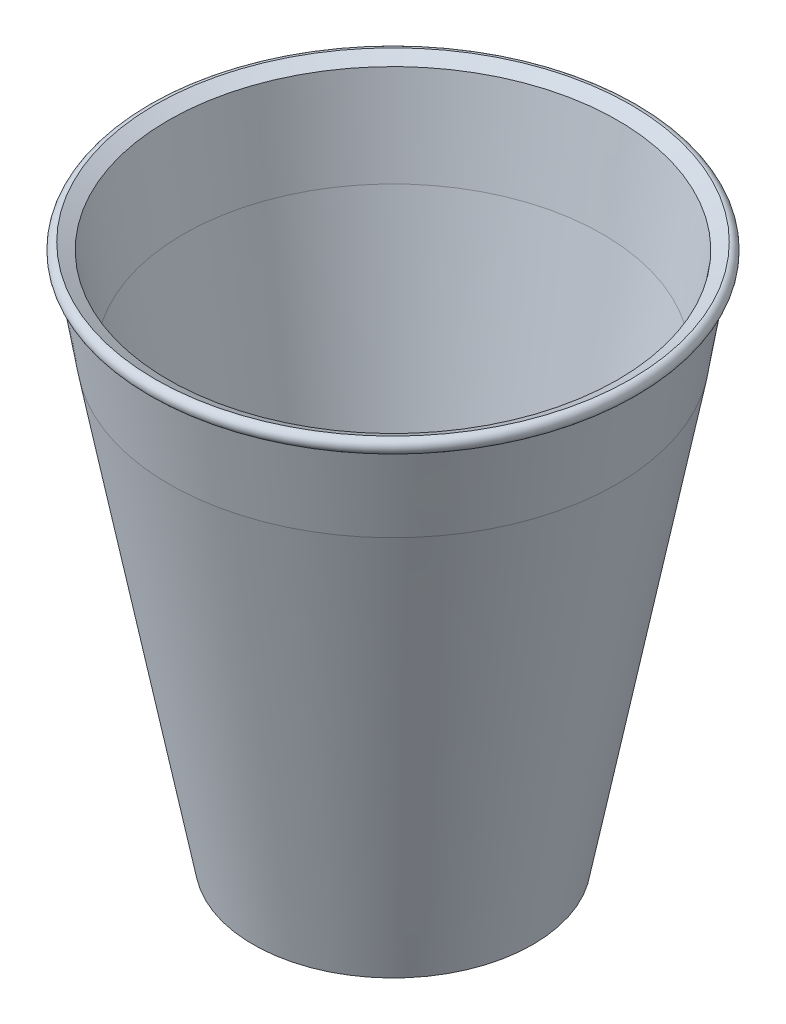
ISO-10303-21;
HEADER;
FILE_DESCRIPTION(('STEP AP214'),'2;1');
FILE_NAME('part.step','',(''),(''),'','','');
FILE_SCHEMA(('AUTOMOTIVE_DESIGN { 1 0 10303 214 1 1 1 1 }'));
ENDSEC;
DATA;
#1=APPLICATION_CONTEXT('core data for automotive mechanical design processes');
#2=APPLICATION_PROTOCOL_DEFINITION('international standard','automotive_design',2000,#1);
#3=PRODUCT_CONTEXT('',#1,'mechanical');
#4=PRODUCT('Part','Part','',(#3));
#5=PRODUCT_RELATED_PRODUCT_CATEGORY('part','',(#4));
#6=PRODUCT_DEFINITION_FORMATION('','',#4);
#7=PRODUCT_DEFINITION_CONTEXT('part definition',#1,'design');
#8=PRODUCT_DEFINITION('design','',#6,#7);
#9=PRODUCT_DEFINITION_SHAPE('','',#8);
#10=(LENGTH_UNIT() NAMED_UNIT(*) SI_UNIT(.MILLI.,.METRE.));
#11=(NAMED_UNIT(*) PLANE_ANGLE_UNIT() SI_UNIT($,.RADIAN.));
#12=(NAMED_UNIT(*) SI_UNIT($,.STERADIAN.) SOLID_ANGLE_UNIT());
#13=UNCERTAINTY_MEASURE_WITH_UNIT(LENGTH_MEASURE(1.E-05),#10,'distance_accuracy_value','');
#14=(GEOMETRIC_REPRESENTATION_CONTEXT(3) GLOBAL_UNCERTAINTY_ASSIGNED_CONTEXT((#13)) GLOBAL_UNIT_ASSIGNED_CONTEXT((#10,
#11,#12)) REPRESENTATION_CONTEXT('',''));
#15=CARTESIAN_POINT('',(0.,0.,0.));
#16=DIRECTION('',(0.,0.,1.));
#17=DIRECTION('',(1.,0.,0.));
#18=AXIS2_PLACEMENT_3D('',#15,#16,#17);
#19=CARTESIAN_POINT('',(-12.6,-75.5,0.));
#20=DIRECTION('',(0.,-1.,0.));
#21=DIRECTION('',(1.,0.,0.));
#22=AXIS2_PLACEMENT_3D('',#19,#20,#21);
#23=PLANE('',#22);
#24=CARTESIAN_POINT('',(0.,-75.5,0.));
#25=DIRECTION('',(0.,1.,0.));
#26=DIRECTION('',(-1.,0.,0.));
#27=AXIS2_PLACEMENT_3D('',#24,#25,#26);
#28=CIRCLE('',#27,12.6);
#29=CARTESIAN_POINT('',(-12.6,-75.5,0.));
#30=VERTEX_POINT('',#29);
#31=EDGE_CURVE('E11',#30,#30,#28,.T.);
#32=ORIENTED_EDGE('',*,*,#31,.F.);
#33=EDGE_LOOP('',(#32));
#34=FACE_BOUND('',#33,.T.);
#35=ADVANCED_FACE('F37',(#34),#23,.T.);
#36=CARTESIAN_POINT('',(0.,0.,0.));
#37=DIRECTION('',(0.,1.,0.));
#38=DIRECTION('',(-1.,0.,0.));
#39=AXIS2_PLACEMENT_3D('',#36,#37,#38);
#40=CYLINDRICAL_SURFACE('',#39,12.6);
#41=DIRECTION('',(0.,-1.,0.));
#42=VECTOR('',#41,1.);
#43=CARTESIAN_POINT('',(12.5975195971271,-76.5,-0.249999999999868));
#44=LINE('',#43,#42);
#45=CARTESIAN_POINT('',(12.5975195971271,-76.5,-0.249999999999868));
#46=VERTEX_POINT('',#45);
#47=CARTESIAN_POINT('',(12.5975195971271,-77.,-0.249999999999867));
#48=VERTEX_POINT('',#47);
#49=EDGE_CURVE('E675',#46,#48,#44,.T.);
#50=ORIENTED_EDGE('',*,*,#49,.F.);
#51=CARTESIAN_POINT('',(0.,-76.5,0.));
#52=DIRECTION('',(0.,-1.,0.));
#53=DIRECTION('',(0.,0.,-1.));
#54=AXIS2_PLACEMENT_3D('',#51,#52,#53);
#55=CIRCLE('',#54,12.6);
#56=CARTESIAN_POINT('',(12.5975195971271,-76.5,0.250000000000132));
#57=VERTEX_POINT('',#56);
#58=EDGE_CURVE('E658',#46,#57,#55,.T.);
#59=ORIENTED_EDGE('',*,*,#58,.T.);
#60=DIRECTION('',(0.,-1.,0.));
#61=VECTOR('',#60,1.);
#62=CARTESIAN_POINT('',(12.5975195971271,-76.5,0.250000000000132));
#63=LINE('',#62,#61);
#64=CARTESIAN_POINT('',(12.5975195971271,-77.,0.250000000000132));
#65=VERTEX_POINT('',#64);
#66=EDGE_CURVE('E657',#57,#65,#63,.T.);
#67=ORIENTED_EDGE('',*,*,#66,.T.);
#68=CARTESIAN_POINT('',(0.,-77.,0.));
#69=DIRECTION('',(0.,1.,0.));
#70=DIRECTION('',(-1.,0.,0.));
#71=AXIS2_PLACEMENT_3D('',#68,#69,#70);
#72=CIRCLE('',#71,12.6);
#73=CARTESIAN_POINT('',(0.250000000000009,-77.,12.597519597127));
#74=VERTEX_POINT('',#73);
#75=EDGE_CURVE('E45',#74,#65,#72,.T.);
#76=ORIENTED_EDGE('',*,*,#75,.F.);
#77=DIRECTION('',(0.,-1.,0.));
#78=VECTOR('',#77,1.);
#79=CARTESIAN_POINT('',(0.250000000000009,-76.5,12.597519597127));
#80=LINE('',#79,#78);
#81=CARTESIAN_POINT('',(0.250000000000009,-76.5,12.597519597127));
#82=VERTEX_POINT('',#81);
#83=EDGE_CURVE('E255',#82,#74,#80,.T.);
#84=ORIENTED_EDGE('',*,*,#83,.F.);
#85=CARTESIAN_POINT('',(0.,-76.5,0.));
#86=DIRECTION('',(0.,-1.,0.));
#87=DIRECTION('',(1.,0.,0.));
#88=AXIS2_PLACEMENT_3D('',#85,#86,#87);
#89=CIRCLE('',#88,12.6);
#90=CARTESIAN_POINT('',(-0.249999999999991,-76.5,12.597519597127));
#91=VERTEX_POINT('',#90);
#92=EDGE_CURVE('E52',#82,#91,#89,.T.);
#93=ORIENTED_EDGE('',*,*,#92,.T.);
#94=DIRECTION('',(0.,-1.,0.));
#95=VECTOR('',#94,1.);
#96=CARTESIAN_POINT('',(-0.249999999999991,-76.5,12.597519597127));
#97=LINE('',#96,#95);
#98=CARTESIAN_POINT('',(-0.249999999999991,-77.,12.597519597127));
#99=VERTEX_POINT('',#98);
#100=EDGE_CURVE('E186',#91,#99,#97,.T.);
#101=ORIENTED_EDGE('',*,*,#100,.T.);
#102=CARTESIAN_POINT('',(-12.597519597127,-77.,0.249999999999955));
#103=VERTEX_POINT('',#102);
#104=EDGE_CURVE('E164',#103,#99,#72,.T.);
#105=ORIENTED_EDGE('',*,*,#104,.F.);
#106=DIRECTION('',(0.,-1.,0.));
#107=VECTOR('',#106,1.);
#108=CARTESIAN_POINT('',(-12.597519597127,-76.5,0.249999999999956));
#109=LINE('',#108,#107);
#110=CARTESIAN_POINT('',(-12.597519597127,-76.5,0.249999999999956));
#111=VERTEX_POINT('',#110);
#112=EDGE_CURVE('E173',#111,#103,#109,.T.);
#113=ORIENTED_EDGE('',*,*,#112,.F.);
#114=CARTESIAN_POINT('',(0.,-76.5,0.));
#115=DIRECTION('',(0.,-1.,0.));
#116=DIRECTION('',(0.,0.,1.));
#117=AXIS2_PLACEMENT_3D('',#114,#115,#116);
#118=CIRCLE('',#117,12.6);
#119=CARTESIAN_POINT('',(-12.597519597127,-76.5,-0.250000000000044));
#120=VERTEX_POINT('',#119);
#121=EDGE_CURVE('E221',#111,#120,#118,.T.);
#122=ORIENTED_EDGE('',*,*,#121,.T.);
#123=DIRECTION('',(0.,-1.,0.));
#124=VECTOR('',#123,1.);
#125=CARTESIAN_POINT('',(-12.597519597127,-76.5,-0.250000000000044));
#126=LINE('',#125,#124);
#127=CARTESIAN_POINT('',(-12.597519597127,-77.,-0.250000000000044));
#128=VERTEX_POINT('',#127);
#129=EDGE_CURVE('E230',#120,#128,#126,.T.);
#130=ORIENTED_EDGE('',*,*,#129,.T.);
#131=CARTESIAN_POINT('',(-0.24999999999999,-77.,-12.597519597127));
#132=VERTEX_POINT('',#131);
#133=EDGE_CURVE('E168',#132,#128,#72,.T.);
#134=ORIENTED_EDGE('',*,*,#133,.F.);
#135=DIRECTION('',(0.,-1.,0.));
#136=VECTOR('',#135,1.);
#137=CARTESIAN_POINT('',(-0.249999999999991,-76.5,-12.597519597127));
#138=LINE('',#137,#136);
#139=CARTESIAN_POINT('',(-0.249999999999991,-76.5,-12.597519597127));
#140=VERTEX_POINT('',#139);
#141=EDGE_CURVE('E224',#140,#132,#138,.T.);
#142=ORIENTED_EDGE('',*,*,#141,.F.);
#143=CARTESIAN_POINT('',(0.,-76.5,0.));
#144=DIRECTION('',(0.,-1.,0.));
#145=DIRECTION('',(-1.,0.,0.));
#146=AXIS2_PLACEMENT_3D('',#143,#144,#145);
#147=CIRCLE('',#146,12.6);
#148=CARTESIAN_POINT('',(0.250000000000009,-76.5,-12.597519597127));
#149=VERTEX_POINT('',#148);
#150=EDGE_CURVE('E205',#140,#149,#147,.T.);
#151=ORIENTED_EDGE('',*,*,#150,.T.);
#152=DIRECTION('',(0.,-1.,0.));
#153=VECTOR('',#152,1.);
#154=CARTESIAN_POINT('',(0.250000000000009,-76.5,-12.597519597127));
#155=LINE('',#154,#153);
#156=CARTESIAN_POINT('',(0.250000000000009,-77.,-12.597519597127));
#157=VERTEX_POINT('',#156);
#158=EDGE_CURVE('E203',#149,#157,#155,.T.);
#159=ORIENTED_EDGE('',*,*,#158,.T.);
#160=EDGE_CURVE('E188',#48,#157,#72,.T.);
#161=ORIENTED_EDGE('',*,*,#160,.F.);
#162=EDGE_LOOP('',(#50,#59,#67,#76,#84,#93,#101,#105,#113,#122,#130,#134,#142,#151,#159,#161));
#163=FACE_BOUND('',#162,.T.);
#164=ORIENTED_EDGE('',*,*,#31,.T.);
#165=EDGE_LOOP('',(#164));
#166=FACE_BOUND('',#165,.T.);
#167=ADVANCED_FACE('F184',(#163,#166),#40,.F.);
#168=CARTESIAN_POINT('',(-20.,-77.,0.));
#169=DIRECTION('',(0.,-1.,0.));
#170=DIRECTION('',(1.,0.,0.));
#171=AXIS2_PLACEMENT_3D('',#168,#169,#170);
#172=PLANE('',#171);
#173=DIRECTION('',(0.,0.,-1.));
#174=VECTOR('',#173,1.);
#175=CARTESIAN_POINT('',(-12.597519597127,-77.,0.249999999999955));
#176=LINE('',#175,#174);
#177=EDGE_CURVE('E148',#103,#128,#176,.T.);
#178=ORIENTED_EDGE('',*,*,#177,.F.);
#179=ORIENTED_EDGE('',*,*,#104,.T.);
#180=DIRECTION('',(-1.,0.,0.));
#181=VECTOR('',#180,1.);
#182=CARTESIAN_POINT('',(0.250000000000009,-77.,12.597519597127));
#183=LINE('',#182,#181);
#184=EDGE_CURVE('E240',#74,#99,#183,.T.);
#185=ORIENTED_EDGE('',*,*,#184,.F.);
#186=ORIENTED_EDGE('',*,*,#75,.T.);
#187=DIRECTION('',(0.,0.,1.));
#188=VECTOR('',#187,1.);
#189=CARTESIAN_POINT('',(12.5975195971271,-77.,-0.249999999999867));
#190=LINE('',#189,#188);
#191=EDGE_CURVE('E200',#48,#65,#190,.T.);
#192=ORIENTED_EDGE('',*,*,#191,.F.);
#193=ORIENTED_EDGE('',*,*,#160,.T.);
#194=DIRECTION('',(1.,0.,0.));
#195=VECTOR('',#194,1.);
#196=CARTESIAN_POINT('',(-0.24999999999999,-77.,-12.597519597127));
#197=LINE('',#196,#195);
#198=EDGE_CURVE('E198',#132,#157,#197,.T.);
#199=ORIENTED_EDGE('',*,*,#198,.F.);
#200=ORIENTED_EDGE('',*,*,#133,.T.);
#201=EDGE_LOOP('',(#178,#179,#185,#186,#192,#193,#199,#200));
#202=FACE_BOUND('',#201,.T.);
#203=CARTESIAN_POINT('',(0.,-77.,0.));
#204=DIRECTION('',(0.,1.,0.));
#205=DIRECTION('',(-1.,0.,0.));
#206=AXIS2_PLACEMENT_3D('',#203,#204,#205);
#207=CIRCLE('',#206,20.);
#208=CARTESIAN_POINT('',(-20.,-77.,0.));
#209=VERTEX_POINT('',#208);
#210=EDGE_CURVE('E187',#209,#209,#207,.T.);
#211=ORIENTED_EDGE('',*,*,#210,.F.);
#212=EDGE_LOOP('',(#211));
#213=FACE_BOUND('',#212,.T.);
#214=ADVANCED_FACE('F160',(#202,#213),#172,.T.);
#215=CARTESIAN_POINT('',(0.,-14.,0.));
#216=DIRECTION('',(0.,1.,0.));
#217=DIRECTION('',(-1.,0.,0.));
#218=AXIS2_PLACEMENT_3D('',#215,#216,#217);
#219=CONICAL_SURFACE('',#218,32.,0.188221505304771);
#220=ORIENTED_EDGE('',*,*,#210,.T.);
#221=EDGE_LOOP('',(#220));
#222=FACE_BOUND('',#221,.T.);
#223=CARTESIAN_POINT('',(0.,-14.,0.));
#224=DIRECTION('',(0.,1.,0.));
#225=DIRECTION('',(-1.,0.,0.));
#226=AXIS2_PLACEMENT_3D('',#223,#224,#225);
#227=CIRCLE('',#226,32.);
#228=CARTESIAN_POINT('',(-32.,-14.,0.));
#229=VERTEX_POINT('',#228);
#230=EDGE_CURVE('E190',#229,#229,#227,.T.);
#231=ORIENTED_EDGE('',*,*,#230,.F.);
#232=EDGE_LOOP('',(#231));
#233=FACE_BOUND('',#232,.T.);
#234=ADVANCED_FACE('F286',(#222,#233),#219,.T.);
#235=CARTESIAN_POINT('',(0.,-2.,0.));
#236=DIRECTION('',(0.,1.,0.));
#237=DIRECTION('',(-1.,0.,0.));
#238=AXIS2_PLACEMENT_3D('',#235,#236,#237);
#239=CONICAL_SURFACE('',#238,34.,0.165148677414627);
#240=ORIENTED_EDGE('',*,*,#230,.T.);
#241=EDGE_LOOP('',(#240));
#242=FACE_BOUND('',#241,.T.);
#243=CARTESIAN_POINT('',(0.,-2.,0.));
#244=DIRECTION('',(0.,1.,0.));
#245=DIRECTION('',(-1.,0.,0.));
#246=AXIS2_PLACEMENT_3D('',#243,#244,#245);
#247=CIRCLE('',#246,34.);
#248=CARTESIAN_POINT('',(-34.,-2.,0.));
#249=VERTEX_POINT('',#248);
#250=EDGE_CURVE('E277',#249,#249,#247,.T.);
#251=ORIENTED_EDGE('',*,*,#250,.F.);
#252=EDGE_LOOP('',(#251));
#253=FACE_BOUND('',#252,.T.);
#254=ADVANCED_FACE('F283',(#242,#253),#239,.T.);
#255=CARTESIAN_POINT('',(0.,-0.999999999999996,0.));
#256=DIRECTION('',(0.,1.,0.));
#257=DIRECTION('',(-1.,0.,0.));
#258=AXIS2_PLACEMENT_3D('',#255,#256,#257);
#259=TOROIDAL_SURFACE('',#258,34.,1.);
#260=ORIENTED_EDGE('',*,*,#250,.T.);
#261=EDGE_LOOP('',(#260));
#262=FACE_BOUND('',#261,.T.);
#263=CARTESIAN_POINT('',(0.,0.,0.));
#264=DIRECTION('',(0.,1.,0.));
#265=DIRECTION('',(-1.,0.,0.));
#266=AXIS2_PLACEMENT_3D('',#263,#264,#265);
#267=CIRCLE('',#266,34.);
#268=CARTESIAN_POINT('',(-34.,0.,0.));
#269=VERTEX_POINT('',#268);
#270=EDGE_CURVE('E274',#269,#269,#267,.T.);
#271=ORIENTED_EDGE('',*,*,#270,.F.);
#272=EDGE_LOOP('',(#271));
#273=FACE_BOUND('',#272,.T.);
#274=ADVANCED_FACE('F294',(#262,#273),#259,.T.);
#275=CARTESIAN_POINT('',(0.,-0.999999999999995,0.));
#276=DIRECTION('',(0.,1.,0.));
#277=DIRECTION('',(-1.,0.,0.));
#278=AXIS2_PLACEMENT_3D('',#275,#276,#277);
#279=CONICAL_SURFACE('',#278,32.130708730816,1.07957178018462);
#280=ORIENTED_EDGE('',*,*,#270,.T.);
#281=EDGE_LOOP('',(#280));
#282=FACE_BOUND('',#281,.T.);
#283=CARTESIAN_POINT('',(0.,-0.999999999999995,0.));
#284=DIRECTION('',(0.,1.,0.));
#285=DIRECTION('',(-1.,0.,0.));
#286=AXIS2_PLACEMENT_3D('',#283,#284,#285);
#287=CIRCLE('',#286,32.130708730816);
#288=CARTESIAN_POINT('',(-32.130708730816,-0.999999999999999,0.));
#289=VERTEX_POINT('',#288);
#290=EDGE_CURVE('E271',#289,#289,#287,.T.);
#291=ORIENTED_EDGE('',*,*,#290,.F.);
#292=EDGE_LOOP('',(#291));
#293=FACE_BOUND('',#292,.T.);
#294=ADVANCED_FACE('F566',(#282,#293),#279,.F.);
#295=CARTESIAN_POINT('',(0.,-14.,0.));
#296=DIRECTION('',(0.,1.,0.));
#297=DIRECTION('',(-1.,0.,0.));
#298=AXIS2_PLACEMENT_3D('',#295,#296,#297);
#299=CONICAL_SURFACE('',#298,29.9640420641493,0.165148677414627);
#300=ORIENTED_EDGE('',*,*,#290,.T.);
#301=EDGE_LOOP('',(#300));
#302=FACE_BOUND('',#301,.T.);
#303=CARTESIAN_POINT('',(0.,-14.,0.));
#304=DIRECTION('',(0.,1.,0.));
#305=DIRECTION('',(-1.,0.,0.));
#306=AXIS2_PLACEMENT_3D('',#303,#304,#305);
#307=CIRCLE('',#306,29.9640420641493);
#308=CARTESIAN_POINT('',(-29.9640420641493,-14.,0.));
#309=VERTEX_POINT('',#308);
#310=EDGE_CURVE('E268',#309,#309,#307,.T.);
#311=ORIENTED_EDGE('',*,*,#310,.F.);
#312=EDGE_LOOP('',(#311));
#313=FACE_BOUND('',#312,.T.);
#314=ADVANCED_FACE('F556',(#302,#313),#299,.F.);
#315=CARTESIAN_POINT('',(0.,-74.,0.));
#316=DIRECTION('',(0.,1.,0.));
#317=DIRECTION('',(-1.,0.,0.));
#318=AXIS2_PLACEMENT_3D('',#315,#316,#317);
#319=CONICAL_SURFACE('',#318,18.5354706355779,0.188221505304771);
#320=ORIENTED_EDGE('',*,*,#310,.T.);
#321=EDGE_LOOP('',(#320));
#322=FACE_BOUND('',#321,.T.);
#323=CARTESIAN_POINT('',(0.,-74.,0.));
#324=DIRECTION('',(0.,1.,0.));
#325=DIRECTION('',(-1.,0.,0.));
#326=AXIS2_PLACEMENT_3D('',#323,#324,#325);
#327=CIRCLE('',#326,18.5354706355779);
#328=CARTESIAN_POINT('',(-18.5354706355779,-74.,0.));
#329=VERTEX_POINT('',#328);
#330=EDGE_CURVE('E258',#329,#329,#327,.T.);
#331=ORIENTED_EDGE('',*,*,#330,.F.);
#332=EDGE_LOOP('',(#331));
#333=FACE_BOUND('',#332,.T.);
#334=ADVANCED_FACE('F546',(#322,#333),#319,.F.);
#335=CARTESIAN_POINT('',(0.,-74.,0.));
#336=DIRECTION('',(0.,1.,0.));
#337=DIRECTION('',(-1.,0.,0.));
#338=AXIS2_PLACEMENT_3D('',#335,#336,#337);
#339=PLANE('',#338);
#340=ORIENTED_EDGE('',*,*,#330,.T.);
#341=EDGE_LOOP('',(#340));
#342=FACE_BOUND('',#341,.T.);
#343=ADVANCED_FACE('F535',(#342),#339,.T.);
#344=CARTESIAN_POINT('',(0.250000000000009,-76.5,12.597519597127));
#345=DIRECTION('',(1.,0.,0.));
#346=DIRECTION('',(0.,0.,-1.));
#347=AXIS2_PLACEMENT_3D('',#344,#345,#346);
#348=PLANE('',#347);
#349=DIRECTION('',(0.,0.384615384615385,-0.923076923076923));
#350=VECTOR('',#349,1.);
#351=CARTESIAN_POINT('',(0.250000000000009,-76.75,11.997519597127));
#352=LINE('',#351,#350);
#353=CARTESIAN_POINT('',(0.250000000000009,-76.75,11.997519597127));
#354=VERTEX_POINT('',#353);
#355=EDGE_CURVE('E237',#74,#354,#352,.T.);
#356=ORIENTED_EDGE('',*,*,#355,.T.);
#357=DIRECTION('',(0.,-1.,0.));
#358=VECTOR('',#357,1.);
#359=CARTESIAN_POINT('',(0.250000000000009,-76.5,11.997519597127));
#360=LINE('',#359,#358);
#361=CARTESIAN_POINT('',(0.250000000000009,-76.5,11.997519597127));
#362=VERTEX_POINT('',#361);
#363=EDGE_CURVE('E259',#362,#354,#360,.T.);
#364=ORIENTED_EDGE('',*,*,#363,.F.);
#365=DIRECTION('',(0.,0.,1.));
#366=VECTOR('',#365,1.);
#367=CARTESIAN_POINT('',(0.250000000000009,-76.5,12.597519597127));
#368=LINE('',#367,#366);
#369=EDGE_CURVE('E253',#362,#82,#368,.T.);
#370=ORIENTED_EDGE('',*,*,#369,.T.);
#371=ORIENTED_EDGE('',*,*,#83,.T.);
#372=EDGE_LOOP('',(#356,#364,#370,#371));
#373=FACE_BOUND('',#372,.T.);
#374=ADVANCED_FACE('F525',(#373),#348,.T.);
#375=CARTESIAN_POINT('',(-0.249999999999991,-76.5,11.997519597127));
#376=DIRECTION('',(0.,0.,-1.));
#377=DIRECTION('',(-1.,0.,0.));
#378=AXIS2_PLACEMENT_3D('',#375,#376,#377);
#379=PLANE('',#378);
#380=DIRECTION('',(-1.,0.,0.));
#381=VECTOR('',#380,1.);
#382=CARTESIAN_POINT('',(0.250000000000009,-76.75,11.997519597127));
#383=LINE('',#382,#381);
#384=CARTESIAN_POINT('',(-0.249999999999991,-76.75,11.997519597127));
#385=VERTEX_POINT('',#384);
#386=EDGE_CURVE('E242',#354,#385,#383,.T.);
#387=ORIENTED_EDGE('',*,*,#386,.T.);
#388=DIRECTION('',(0.,-1.,0.));
#389=VECTOR('',#388,1.);
#390=CARTESIAN_POINT('',(-0.249999999999991,-76.5,11.997519597127));
#391=LINE('',#390,#389);
#392=CARTESIAN_POINT('',(-0.249999999999991,-76.5,11.997519597127));
#393=VERTEX_POINT('',#392);
#394=EDGE_CURVE('E262',#393,#385,#391,.T.);
#395=ORIENTED_EDGE('',*,*,#394,.F.);
#396=DIRECTION('',(1.,0.,0.));
#397=VECTOR('',#396,1.);
#398=CARTESIAN_POINT('',(-0.249999999999991,-76.5,11.997519597127));
#399=LINE('',#398,#397);
#400=EDGE_CURVE('E250',#393,#362,#399,.T.);
#401=ORIENTED_EDGE('',*,*,#400,.T.);
#402=ORIENTED_EDGE('',*,*,#363,.T.);
#403=EDGE_LOOP('',(#387,#395,#401,#402));
#404=FACE_BOUND('',#403,.T.);
#405=ADVANCED_FACE('F515',(#404),#379,.T.);
#406=CARTESIAN_POINT('',(-0.249999999999991,-76.5,12.597519597127));
#407=DIRECTION('',(-1.,0.,0.));
#408=DIRECTION('',(0.,-1.,0.));
#409=AXIS2_PLACEMENT_3D('',#406,#407,#408);
#410=PLANE('',#409);
#411=DIRECTION('',(0.,0.384615384615385,-0.923076923076923));
#412=VECTOR('',#411,1.);
#413=CARTESIAN_POINT('',(-0.249999999999991,-76.75,11.997519597127));
#414=LINE('',#413,#412);
#415=EDGE_CURVE('E179',#99,#385,#414,.T.);
#416=ORIENTED_EDGE('',*,*,#415,.F.);
#417=ORIENTED_EDGE('',*,*,#100,.F.);
#418=DIRECTION('',(0.,0.,-1.));
#419=VECTOR('',#418,1.);
#420=CARTESIAN_POINT('',(-0.249999999999991,-76.5,12.597519597127));
#421=LINE('',#420,#419);
#422=EDGE_CURVE('E247',#91,#393,#421,.T.);
#423=ORIENTED_EDGE('',*,*,#422,.T.);
#424=ORIENTED_EDGE('',*,*,#394,.T.);
#425=EDGE_LOOP('',(#416,#417,#423,#424));
#426=FACE_BOUND('',#425,.T.);
#427=ADVANCED_FACE('F506',(#426),#410,.T.);
#428=CARTESIAN_POINT('',(0.,-76.5,0.));
#429=DIRECTION('',(0.,-1.,0.));
#430=DIRECTION('',(1.,0.,0.));
#431=AXIS2_PLACEMENT_3D('',#428,#429,#430);
#432=PLANE('',#431);
#433=ORIENTED_EDGE('',*,*,#92,.F.);
#434=ORIENTED_EDGE('',*,*,#369,.F.);
#435=ORIENTED_EDGE('',*,*,#400,.F.);
#436=ORIENTED_EDGE('',*,*,#422,.F.);
#437=EDGE_LOOP('',(#433,#434,#435,#436));
#438=FACE_BOUND('',#437,.T.);
#439=ADVANCED_FACE('F496',(#438),#432,.F.);
#440=CARTESIAN_POINT('',(0.250000000000009,-76.75,11.997519597127));
#441=DIRECTION('',(0.,0.923076923076923,0.384615384615385));
#442=DIRECTION('',(0.,-0.384615384615385,0.923076923076923));
#443=AXIS2_PLACEMENT_3D('',#440,#441,#442);
#444=PLANE('',#443);
#445=ORIENTED_EDGE('',*,*,#415,.T.);
#446=ORIENTED_EDGE('',*,*,#386,.F.);
#447=ORIENTED_EDGE('',*,*,#355,.F.);
#448=ORIENTED_EDGE('',*,*,#184,.T.);
#449=EDGE_LOOP('',(#445,#446,#447,#448));
#450=FACE_BOUND('',#449,.T.);
#451=ADVANCED_FACE('F321',(#450),#444,.F.);
#452=CARTESIAN_POINT('',(-12.597519597127,-76.5,0.249999999999956));
#453=DIRECTION('',(0.,0.,1.));
#454=DIRECTION('',(1.,0.,0.));
#455=AXIS2_PLACEMENT_3D('',#452,#453,#454);
#456=PLANE('',#455);
#457=DIRECTION('',(0.923076923076923,0.384615384615385,0.));
#458=VECTOR('',#457,1.);
#459=CARTESIAN_POINT('',(-11.997519597127,-76.75,0.249999999999957));
#460=LINE('',#459,#458);
#461=CARTESIAN_POINT('',(-11.997519597127,-76.75,0.249999999999957));
#462=VERTEX_POINT('',#461);
#463=EDGE_CURVE('E145',#103,#462,#460,.T.);
#464=ORIENTED_EDGE('',*,*,#463,.T.);
#465=DIRECTION('',(0.,-1.,0.));
#466=VECTOR('',#465,1.);
#467=CARTESIAN_POINT('',(-11.997519597127,-76.5,0.249999999999958));
#468=LINE('',#467,#466);
#469=CARTESIAN_POINT('',(-11.997519597127,-76.5,0.249999999999958));
#470=VERTEX_POINT('',#469);
#471=EDGE_CURVE('E180',#470,#462,#468,.T.);
#472=ORIENTED_EDGE('',*,*,#471,.F.);
#473=DIRECTION('',(-1.,0.,0.));
#474=VECTOR('',#473,1.);
#475=CARTESIAN_POINT('',(-12.597519597127,-76.5,0.249999999999956));
#476=LINE('',#475,#474);
#477=EDGE_CURVE('E176',#470,#111,#476,.T.);
#478=ORIENTED_EDGE('',*,*,#477,.T.);
#479=ORIENTED_EDGE('',*,*,#112,.T.);
#480=EDGE_LOOP('',(#464,#472,#478,#479));
#481=FACE_BOUND('',#480,.T.);
#482=ADVANCED_FACE('F174',(#481),#456,.T.);
#483=CARTESIAN_POINT('',(-11.997519597127,-76.5,-0.250000000000042));
#484=DIRECTION('',(1.,0.,0.));
#485=DIRECTION('',(0.,0.,-1.));
#486=AXIS2_PLACEMENT_3D('',#483,#484,#485);
#487=PLANE('',#486);
#488=DIRECTION('',(0.,0.,-1.));
#489=VECTOR('',#488,1.);
#490=CARTESIAN_POINT('',(-11.997519597127,-76.75,0.249999999999957));
#491=LINE('',#490,#489);
#492=CARTESIAN_POINT('',(-11.997519597127,-76.75,-0.250000000000043));
#493=VERTEX_POINT('',#492);
#494=EDGE_CURVE('E151',#462,#493,#491,.T.);
#495=ORIENTED_EDGE('',*,*,#494,.T.);
#496=DIRECTION('',(0.,-1.,0.));
#497=VECTOR('',#496,1.);
#498=CARTESIAN_POINT('',(-11.997519597127,-76.5,-0.250000000000042));
#499=LINE('',#498,#497);
#500=CARTESIAN_POINT('',(-11.997519597127,-76.5,-0.250000000000042));
#501=VERTEX_POINT('',#500);
#502=EDGE_CURVE('E233',#501,#493,#499,.T.);
#503=ORIENTED_EDGE('',*,*,#502,.F.);
#504=DIRECTION('',(0.,0.,1.));
#505=VECTOR('',#504,1.);
#506=CARTESIAN_POINT('',(-11.997519597127,-76.5,-0.250000000000042));
#507=LINE('',#506,#505);
#508=EDGE_CURVE('E227',#501,#470,#507,.T.);
#509=ORIENTED_EDGE('',*,*,#508,.T.);
#510=ORIENTED_EDGE('',*,*,#471,.T.);
#511=EDGE_LOOP('',(#495,#503,#509,#510));
#512=FACE_BOUND('',#511,.T.);
#513=ADVANCED_FACE('F320',(#512),#487,.T.);
#514=CARTESIAN_POINT('',(-12.597519597127,-76.5,-0.250000000000044));
#515=DIRECTION('',(0.,0.,-1.));
#516=DIRECTION('',(-1.,0.,0.));
#517=AXIS2_PLACEMENT_3D('',#514,#515,#516);
#518=PLANE('',#517);
#519=DIRECTION('',(0.923076923076923,0.384615384615385,0.));
#520=VECTOR('',#519,1.);
#521=CARTESIAN_POINT('',(-11.997519597127,-76.75,-0.250000000000043));
#522=LINE('',#521,#520);
#523=EDGE_CURVE('E155',#128,#493,#522,.T.);
#524=ORIENTED_EDGE('',*,*,#523,.F.);
#525=ORIENTED_EDGE('',*,*,#129,.F.);
#526=DIRECTION('',(1.,0.,0.));
#527=VECTOR('',#526,1.);
#528=CARTESIAN_POINT('',(-12.597519597127,-76.5,-0.250000000000044));
#529=LINE('',#528,#527);
#530=EDGE_CURVE('E223',#120,#501,#529,.T.);
#531=ORIENTED_EDGE('',*,*,#530,.T.);
#532=ORIENTED_EDGE('',*,*,#502,.T.);
#533=EDGE_LOOP('',(#524,#525,#531,#532));
#534=FACE_BOUND('',#533,.T.);
#535=ADVANCED_FACE('F332',(#534),#518,.T.);
#536=CARTESIAN_POINT('',(0.,-76.5,0.));
#537=DIRECTION('',(0.,-1.,0.));
#538=DIRECTION('',(0.,0.,1.));
#539=AXIS2_PLACEMENT_3D('',#536,#537,#538);
#540=PLANE('',#539);
#541=ORIENTED_EDGE('',*,*,#121,.F.);
#542=ORIENTED_EDGE('',*,*,#477,.F.);
#543=ORIENTED_EDGE('',*,*,#508,.F.);
#544=ORIENTED_EDGE('',*,*,#530,.F.);
#545=EDGE_LOOP('',(#541,#542,#543,#544));
#546=FACE_BOUND('',#545,.T.);
#547=ADVANCED_FACE('F343',(#546),#540,.F.);
#548=CARTESIAN_POINT('',(-0.249999999999991,-76.5,-12.597519597127));
#549=DIRECTION('',(-1.,0.,0.));
#550=DIRECTION('',(0.,0.,1.));
#551=AXIS2_PLACEMENT_3D('',#548,#549,#550);
#552=PLANE('',#551);
#553=DIRECTION('',(0.,0.384615384615385,0.923076923076923));
#554=VECTOR('',#553,1.);
#555=CARTESIAN_POINT('',(-0.24999999999999,-76.75,-11.997519597127));
#556=LINE('',#555,#554);
#557=CARTESIAN_POINT('',(-0.24999999999999,-76.75,-11.997519597127));
#558=VERTEX_POINT('',#557);
#559=EDGE_CURVE('E685',#132,#558,#556,.T.);
#560=ORIENTED_EDGE('',*,*,#559,.T.);
#561=DIRECTION('',(0.,-1.,0.));
#562=VECTOR('',#561,1.);
#563=CARTESIAN_POINT('',(-0.249999999999991,-76.5,-11.997519597127));
#564=LINE('',#563,#562);
#565=CARTESIAN_POINT('',(-0.249999999999991,-76.5,-11.997519597127));
#566=VERTEX_POINT('',#565);
#567=EDGE_CURVE('E214',#566,#558,#564,.T.);
#568=ORIENTED_EDGE('',*,*,#567,.F.);
#569=DIRECTION('',(0.,0.,-1.));
#570=VECTOR('',#569,1.);
#571=CARTESIAN_POINT('',(-0.249999999999991,-76.5,-12.597519597127));
#572=LINE('',#571,#570);
#573=EDGE_CURVE('E211',#566,#140,#572,.T.);
#574=ORIENTED_EDGE('',*,*,#573,.T.);
#575=ORIENTED_EDGE('',*,*,#141,.T.);
#576=EDGE_LOOP('',(#560,#568,#574,#575));
#577=FACE_BOUND('',#576,.T.);
#578=ADVANCED_FACE('F354',(#577),#552,.T.);
#579=CARTESIAN_POINT('',(0.250000000000009,-76.5,-11.997519597127));
#580=DIRECTION('',(0.,0.,1.));
#581=DIRECTION('',(1.,0.,0.));
#582=AXIS2_PLACEMENT_3D('',#579,#580,#581);
#583=PLANE('',#582);
#584=DIRECTION('',(1.,0.,0.));
#585=VECTOR('',#584,1.);
#586=CARTESIAN_POINT('',(-0.24999999999999,-76.75,-11.997519597127));
#587=LINE('',#586,#585);
#588=CARTESIAN_POINT('',(0.25000000000001,-76.75,-11.997519597127));
#589=VERTEX_POINT('',#588);
#590=EDGE_CURVE('E681',#558,#589,#587,.T.);
#591=ORIENTED_EDGE('',*,*,#590,.T.);
#592=DIRECTION('',(0.,-1.,0.));
#593=VECTOR('',#592,1.);
#594=CARTESIAN_POINT('',(0.250000000000009,-76.5,-11.997519597127));
#595=LINE('',#594,#593);
#596=CARTESIAN_POINT('',(0.250000000000009,-76.5,-11.997519597127));
#597=VERTEX_POINT('',#596);
#598=EDGE_CURVE('E210',#597,#589,#595,.T.);
#599=ORIENTED_EDGE('',*,*,#598,.F.);
#600=DIRECTION('',(-1.,0.,0.));
#601=VECTOR('',#600,1.);
#602=CARTESIAN_POINT('',(0.250000000000009,-76.5,-11.997519597127));
#603=LINE('',#602,#601);
#604=EDGE_CURVE('E217',#597,#566,#603,.T.);
#605=ORIENTED_EDGE('',*,*,#604,.T.);
#606=ORIENTED_EDGE('',*,*,#567,.T.);
#607=EDGE_LOOP('',(#591,#599,#605,#606));
#608=FACE_BOUND('',#607,.T.);
#609=ADVANCED_FACE('F365',(#608),#583,.T.);
#610=CARTESIAN_POINT('',(0.250000000000009,-76.5,-12.597519597127));
#611=DIRECTION('',(1.,0.,0.));
#612=DIRECTION('',(0.,1.,0.));
#613=AXIS2_PLACEMENT_3D('',#610,#611,#612);
#614=PLANE('',#613);
#615=DIRECTION('',(0.,0.384615384615385,0.923076923076923));
#616=VECTOR('',#615,1.);
#617=CARTESIAN_POINT('',(0.25000000000001,-76.75,-11.997519597127));
#618=LINE('',#617,#616);
#619=EDGE_CURVE('E686',#157,#589,#618,.T.);
#620=ORIENTED_EDGE('',*,*,#619,.F.);
#621=ORIENTED_EDGE('',*,*,#158,.F.);
#622=DIRECTION('',(0.,0.,1.));
#623=VECTOR('',#622,1.);
#624=CARTESIAN_POINT('',(0.250000000000009,-76.5,-12.597519597127));
#625=LINE('',#624,#623);
#626=EDGE_CURVE('E674',#149,#597,#625,.T.);
#627=ORIENTED_EDGE('',*,*,#626,.T.);
#628=ORIENTED_EDGE('',*,*,#598,.T.);
#629=EDGE_LOOP('',(#620,#621,#627,#628));
#630=FACE_BOUND('',#629,.T.);
#631=ADVANCED_FACE('F376',(#630),#614,.T.);
#632=CARTESIAN_POINT('',(0.,-76.5,0.));
#633=DIRECTION('',(0.,-1.,0.));
#634=DIRECTION('',(-1.,0.,0.));
#635=AXIS2_PLACEMENT_3D('',#632,#633,#634);
#636=PLANE('',#635);
#637=ORIENTED_EDGE('',*,*,#150,.F.);
#638=ORIENTED_EDGE('',*,*,#573,.F.);
#639=ORIENTED_EDGE('',*,*,#604,.F.);
#640=ORIENTED_EDGE('',*,*,#626,.F.);
#641=EDGE_LOOP('',(#637,#638,#639,#640));
#642=FACE_BOUND('',#641,.T.);
#643=ADVANCED_FACE('F387',(#642),#636,.F.);
#644=CARTESIAN_POINT('',(12.5975195971271,-76.5,-0.249999999999868));
#645=DIRECTION('',(0.,0.,-1.));
#646=DIRECTION('',(-1.,0.,0.));
#647=AXIS2_PLACEMENT_3D('',#644,#645,#646);
#648=PLANE('',#647);
#649=DIRECTION('',(-0.923076923076923,0.384615384615385,0.));
#650=VECTOR('',#649,1.);
#651=CARTESIAN_POINT('',(11.9975195971271,-76.75,-0.249999999999874));
#652=LINE('',#651,#650);
#653=CARTESIAN_POINT('',(11.9975195971271,-76.75,-0.249999999999874));
#654=VERTEX_POINT('',#653);
#655=EDGE_CURVE('E694',#48,#654,#652,.T.);
#656=ORIENTED_EDGE('',*,*,#655,.T.);
#657=DIRECTION('',(0.,-1.,0.));
#658=VECTOR('',#657,1.);
#659=CARTESIAN_POINT('',(11.9975195971271,-76.5,-0.249999999999874));
#660=LINE('',#659,#658);
#661=CARTESIAN_POINT('',(11.9975195971271,-76.5,-0.249999999999874));
#662=VERTEX_POINT('',#661);
#663=EDGE_CURVE('E666',#662,#654,#660,.T.);
#664=ORIENTED_EDGE('',*,*,#663,.F.);
#665=DIRECTION('',(1.,0.,0.));
#666=VECTOR('',#665,1.);
#667=CARTESIAN_POINT('',(12.5975195971271,-76.5,-0.249999999999868));
#668=LINE('',#667,#666);
#669=EDGE_CURVE('E663',#662,#46,#668,.T.);
#670=ORIENTED_EDGE('',*,*,#669,.T.);
#671=ORIENTED_EDGE('',*,*,#49,.T.);
#672=EDGE_LOOP('',(#656,#664,#670,#671));
#673=FACE_BOUND('',#672,.T.);
#674=ADVANCED_FACE('F397',(#673),#648,.T.);
#675=CARTESIAN_POINT('',(11.9975195971271,-76.5,0.250000000000126));
#676=DIRECTION('',(-1.,0.,0.));
#677=DIRECTION('',(0.,0.,1.));
#678=AXIS2_PLACEMENT_3D('',#675,#676,#677);
#679=PLANE('',#678);
#680=DIRECTION('',(0.,0.,1.));
#681=VECTOR('',#680,1.);
#682=CARTESIAN_POINT('',(11.9975195971271,-76.75,-0.249999999999874));
#683=LINE('',#682,#681);
#684=CARTESIAN_POINT('',(11.9975195971271,-76.75,0.250000000000126));
#685=VERTEX_POINT('',#684);
#686=EDGE_CURVE('E689',#654,#685,#683,.T.);
#687=ORIENTED_EDGE('',*,*,#686,.T.);
#688=DIRECTION('',(0.,-1.,0.));
#689=VECTOR('',#688,1.);
#690=CARTESIAN_POINT('',(11.9975195971271,-76.5,0.250000000000126));
#691=LINE('',#690,#689);
#692=CARTESIAN_POINT('',(11.9975195971271,-76.5,0.250000000000126));
#693=VERTEX_POINT('',#692);
#694=EDGE_CURVE('E662',#693,#685,#691,.T.);
#695=ORIENTED_EDGE('',*,*,#694,.F.);
#696=DIRECTION('',(0.,0.,-1.));
#697=VECTOR('',#696,1.);
#698=CARTESIAN_POINT('',(11.9975195971271,-76.5,0.250000000000126));
#699=LINE('',#698,#697);
#700=EDGE_CURVE('E669',#693,#662,#699,.T.);
#701=ORIENTED_EDGE('',*,*,#700,.T.);
#702=ORIENTED_EDGE('',*,*,#663,.T.);
#703=EDGE_LOOP('',(#687,#695,#701,#702));
#704=FACE_BOUND('',#703,.T.);
#705=ADVANCED_FACE('F408',(#704),#679,.T.);
#706=CARTESIAN_POINT('',(12.5975195971271,-76.5,0.250000000000132));
#707=DIRECTION('',(0.,0.,1.));
#708=DIRECTION('',(1.,0.,0.));
#709=AXIS2_PLACEMENT_3D('',#706,#707,#708);
#710=PLANE('',#709);
#711=DIRECTION('',(-0.923076923076923,0.384615384615385,0.));
#712=VECTOR('',#711,1.);
#713=CARTESIAN_POINT('',(11.9975195971271,-76.75,0.250000000000126));
#714=LINE('',#713,#712);
#715=EDGE_CURVE('E697',#65,#685,#714,.T.);
#716=ORIENTED_EDGE('',*,*,#715,.F.);
#717=ORIENTED_EDGE('',*,*,#66,.F.);
#718=DIRECTION('',(-1.,0.,0.));
#719=VECTOR('',#718,1.);
#720=CARTESIAN_POINT('',(12.5975195971271,-76.5,0.250000000000132));
#721=LINE('',#720,#719);
#722=EDGE_CURVE('E703',#57,#693,#721,.T.);
#723=ORIENTED_EDGE('',*,*,#722,.T.);
#724=ORIENTED_EDGE('',*,*,#694,.T.);
#725=EDGE_LOOP('',(#716,#717,#723,#724));
#726=FACE_BOUND('',#725,.T.);
#727=ADVANCED_FACE('F419',(#726),#710,.T.);
#728=CARTESIAN_POINT('',(0.,-76.5,0.));
#729=DIRECTION('',(0.,-1.,0.));
#730=DIRECTION('',(0.,0.,-1.));
#731=AXIS2_PLACEMENT_3D('',#728,#729,#730);
#732=PLANE('',#731);
#733=ORIENTED_EDGE('',*,*,#58,.F.);
#734=ORIENTED_EDGE('',*,*,#669,.F.);
#735=ORIENTED_EDGE('',*,*,#700,.F.);
#736=ORIENTED_EDGE('',*,*,#722,.F.);
#737=EDGE_LOOP('',(#733,#734,#735,#736));
#738=FACE_BOUND('',#737,.T.);
#739=ADVANCED_FACE('F430',(#738),#732,.F.);
#740=CARTESIAN_POINT('',(11.9975195971271,-76.75,-0.249999999999874));
#741=DIRECTION('',(0.384615384615385,0.923076923076923,0.));
#742=DIRECTION('',(-0.923076923076923,0.384615384615385,0.));
#743=AXIS2_PLACEMENT_3D('',#740,#741,#742);
#744=PLANE('',#743);
#745=ORIENTED_EDGE('',*,*,#715,.T.);
#746=ORIENTED_EDGE('',*,*,#686,.F.);
#747=ORIENTED_EDGE('',*,*,#655,.F.);
#748=ORIENTED_EDGE('',*,*,#191,.T.);
#749=EDGE_LOOP('',(#745,#746,#747,#748));
#750=FACE_BOUND('',#749,.T.);
#751=ADVANCED_FACE('F441',(#750),#744,.F.);
#752=CARTESIAN_POINT('',(-0.24999999999999,-76.75,-11.997519597127));
#753=DIRECTION('',(0.,0.923076923076923,-0.384615384615385));
#754=DIRECTION('',(0.,0.384615384615385,0.923076923076923));
#755=AXIS2_PLACEMENT_3D('',#752,#753,#754);
#756=PLANE('',#755);
#757=ORIENTED_EDGE('',*,*,#619,.T.);
#758=ORIENTED_EDGE('',*,*,#590,.F.);
#759=ORIENTED_EDGE('',*,*,#559,.F.);
#760=ORIENTED_EDGE('',*,*,#198,.T.);
#761=EDGE_LOOP('',(#757,#758,#759,#760));
#762=FACE_BOUND('',#761,.T.);
#763=ADVANCED_FACE('F452',(#762),#756,.F.);
#764=CARTESIAN_POINT('',(-11.997519597127,-76.75,0.249999999999957));
#765=DIRECTION('',(-0.384615384615385,0.923076923076923,0.));
#766=DIRECTION('',(-0.923076923076923,-0.384615384615385,0.));
#767=AXIS2_PLACEMENT_3D('',#764,#765,#766);
#768=PLANE('',#767);
#769=ORIENTED_EDGE('',*,*,#523,.T.);
#770=ORIENTED_EDGE('',*,*,#494,.F.);
#771=ORIENTED_EDGE('',*,*,#463,.F.);
#772=ORIENTED_EDGE('',*,*,#177,.T.);
#773=EDGE_LOOP('',(#769,#770,#771,#772));
#774=FACE_BOUND('',#773,.T.);
#775=ADVANCED_FACE('F147',(#774),#768,.F.);
#776=CLOSED_SHELL('',(#35,#167,#214,#234,#254,#274,#294,#314,#334,#343,#374,#405,#427,#439,#451,
#482,#513,#535,#547,#578,#609,#631,#643,#674,#705,#727,#739,#751,#763,#775));
#777=MANIFOLD_SOLID_BREP('B2',#776);
#778=ADVANCED_BREP_SHAPE_REPRESENTATION('',(#18,#777),#14);
#779=SHAPE_DEFINITION_REPRESENTATION(#9,#778);
ENDSEC;
END-ISO-10303-21;
